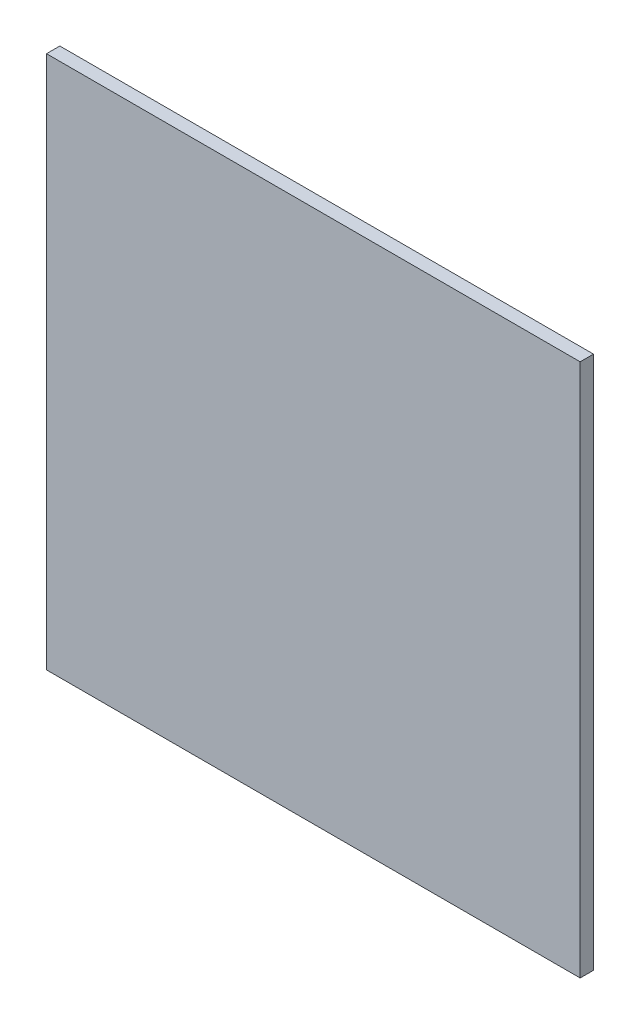
ISO-10303-21;
HEADER;
FILE_DESCRIPTION(('STEP AP214'),'2;1');
FILE_NAME('part.step','',(''),(''),'','','');
FILE_SCHEMA(('AUTOMOTIVE_DESIGN { 1 0 10303 214 1 1 1 1 }'));
ENDSEC;
DATA;
#1=APPLICATION_CONTEXT('core data for automotive mechanical design processes');
#2=APPLICATION_PROTOCOL_DEFINITION('international standard','automotive_design',2000,#1);
#3=PRODUCT_CONTEXT('',#1,'mechanical');
#4=PRODUCT('Part','Part','',(#3));
#5=PRODUCT_RELATED_PRODUCT_CATEGORY('part','',(#4));
#6=PRODUCT_DEFINITION_FORMATION('','',#4);
#7=PRODUCT_DEFINITION_CONTEXT('part definition',#1,'design');
#8=PRODUCT_DEFINITION('design','',#6,#7);
#9=PRODUCT_DEFINITION_SHAPE('','',#8);
#10=(LENGTH_UNIT() NAMED_UNIT(*) SI_UNIT(.MILLI.,.METRE.));
#11=(NAMED_UNIT(*) PLANE_ANGLE_UNIT() SI_UNIT($,.RADIAN.));
#12=(NAMED_UNIT(*) SI_UNIT($,.STERADIAN.) SOLID_ANGLE_UNIT());
#13=UNCERTAINTY_MEASURE_WITH_UNIT(LENGTH_MEASURE(1.E-05),#10,'distance_accuracy_value','');
#14=(GEOMETRIC_REPRESENTATION_CONTEXT(3) GLOBAL_UNCERTAINTY_ASSIGNED_CONTEXT((#13)) GLOBAL_UNIT_ASSIGNED_CONTEXT((#10,
#11,#12)) REPRESENTATION_CONTEXT('',''));
#15=CARTESIAN_POINT('',(0.,0.,0.));
#16=DIRECTION('',(0.,0.,1.));
#17=DIRECTION('',(1.,0.,0.));
#18=AXIS2_PLACEMENT_3D('',#15,#16,#17);
#19=CARTESIAN_POINT('',(-0.0025,0.0025,0.));
#20=DIRECTION('',(0.,0.,1.));
#21=DIRECTION('',(1.,0.,0.));
#22=AXIS2_PLACEMENT_3D('',#19,#20,#21);
#23=PLANE('',#22);
#24=DIRECTION('',(1.,0.,0.));
#25=VECTOR('',#24,1.);
#26=CARTESIAN_POINT('',(2.,2.005,0.));
#27=LINE('',#26,#25);
#28=CARTESIAN_POINT('',(2.,2.005,0.));
#29=VERTEX_POINT('',#28);
#30=CARTESIAN_POINT('',(-2.005,2.005,0.));
#31=VERTEX_POINT('',#30);
#32=EDGE_CURVE('E79',#29,#31,#27,.F.);
#33=ORIENTED_EDGE('',*,*,#32,.F.);
#34=DIRECTION('',(0.,1.,0.));
#35=VECTOR('',#34,1.);
#36=CARTESIAN_POINT('',(2.,-2.,0.));
#37=LINE('',#36,#35);
#38=CARTESIAN_POINT('',(2.,-2.,0.));
#39=VERTEX_POINT('',#38);
#40=EDGE_CURVE('E55',#39,#29,#37,.T.);
#41=ORIENTED_EDGE('',*,*,#40,.F.);
#42=DIRECTION('',(1.,0.,0.));
#43=VECTOR('',#42,1.);
#44=CARTESIAN_POINT('',(-2.005,-2.,0.));
#45=LINE('',#44,#43);
#46=CARTESIAN_POINT('',(-2.005,-2.,0.));
#47=VERTEX_POINT('',#46);
#48=EDGE_CURVE('E57',#47,#39,#45,.T.);
#49=ORIENTED_EDGE('',*,*,#48,.F.);
#50=DIRECTION('',(0.,1.,0.));
#51=VECTOR('',#50,1.);
#52=CARTESIAN_POINT('',(-2.005,2.005,0.));
#53=LINE('',#52,#51);
#54=EDGE_CURVE('E20',#31,#47,#53,.F.);
#55=ORIENTED_EDGE('',*,*,#54,.F.);
#56=EDGE_LOOP('',(#33,#41,#49,#55));
#57=FACE_BOUND('',#56,.T.);
#58=ADVANCED_FACE('F17',(#57),#23,.F.);
#59=CARTESIAN_POINT('',(-2.005,2.005,0.));
#60=DIRECTION('',(-1.,0.,0.));
#61=DIRECTION('',(0.,0.,1.));
#62=AXIS2_PLACEMENT_3D('',#59,#60,#61);
#63=PLANE('',#62);
#64=DIRECTION('',(0.,1.,0.));
#65=VECTOR('',#64,1.);
#66=CARTESIAN_POINT('',(-2.005,0.0025,0.1));
#67=LINE('',#66,#65);
#68=CARTESIAN_POINT('',(-2.005,2.005,0.1));
#69=VERTEX_POINT('',#68);
#70=CARTESIAN_POINT('',(-2.005,-2.,0.1));
#71=VERTEX_POINT('',#70);
#72=EDGE_CURVE('E83',#69,#71,#67,.F.);
#73=ORIENTED_EDGE('',*,*,#72,.F.);
#74=DIRECTION('',(0.,0.,1.));
#75=VECTOR('',#74,1.);
#76=CARTESIAN_POINT('',(-2.005,2.005,0.));
#77=LINE('',#76,#75);
#78=EDGE_CURVE('E68',#31,#69,#77,.T.);
#79=ORIENTED_EDGE('',*,*,#78,.F.);
#80=ORIENTED_EDGE('',*,*,#54,.T.);
#81=DIRECTION('',(0.,0.,-1.));
#82=VECTOR('',#81,1.);
#83=CARTESIAN_POINT('',(-2.005,-2.,0.));
#84=LINE('',#83,#82);
#85=EDGE_CURVE('E63',#71,#47,#84,.T.);
#86=ORIENTED_EDGE('',*,*,#85,.F.);
#87=EDGE_LOOP('',(#73,#79,#80,#86));
#88=FACE_BOUND('',#87,.T.);
#89=ADVANCED_FACE('F65',(#88),#63,.T.);
#90=CARTESIAN_POINT('',(-2.005,-2.,0.));
#91=DIRECTION('',(0.,-1.,0.));
#92=DIRECTION('',(0.,0.,-1.));
#93=AXIS2_PLACEMENT_3D('',#90,#91,#92);
#94=PLANE('',#93);
#95=DIRECTION('',(1.,0.,0.));
#96=VECTOR('',#95,1.);
#97=CARTESIAN_POINT('',(-0.0025,-2.,0.1));
#98=LINE('',#97,#96);
#99=CARTESIAN_POINT('',(2.,-2.,0.1));
#100=VERTEX_POINT('',#99);
#101=EDGE_CURVE('E72',#71,#100,#98,.T.);
#102=ORIENTED_EDGE('',*,*,#101,.F.);
#103=ORIENTED_EDGE('',*,*,#85,.T.);
#104=ORIENTED_EDGE('',*,*,#48,.T.);
#105=DIRECTION('',(0.,0.,-1.));
#106=VECTOR('',#105,1.);
#107=CARTESIAN_POINT('',(2.,-2.,0.));
#108=LINE('',#107,#106);
#109=EDGE_CURVE('E75',#100,#39,#108,.T.);
#110=ORIENTED_EDGE('',*,*,#109,.F.);
#111=EDGE_LOOP('',(#102,#103,#104,#110));
#112=FACE_BOUND('',#111,.T.);
#113=ADVANCED_FACE('F70',(#112),#94,.T.);
#114=CARTESIAN_POINT('',(2.,-2.,0.));
#115=DIRECTION('',(1.,0.,0.));
#116=DIRECTION('',(0.,0.,-1.));
#117=AXIS2_PLACEMENT_3D('',#114,#115,#116);
#118=PLANE('',#117);
#119=DIRECTION('',(0.,1.,0.));
#120=VECTOR('',#119,1.);
#121=CARTESIAN_POINT('',(2.,0.0025,0.1));
#122=LINE('',#121,#120);
#123=CARTESIAN_POINT('',(2.,2.005,0.1));
#124=VERTEX_POINT('',#123);
#125=EDGE_CURVE('E26',#100,#124,#122,.T.);
#126=ORIENTED_EDGE('',*,*,#125,.F.);
#127=ORIENTED_EDGE('',*,*,#109,.T.);
#128=ORIENTED_EDGE('',*,*,#40,.T.);
#129=DIRECTION('',(0.,0.,1.));
#130=VECTOR('',#129,1.);
#131=CARTESIAN_POINT('',(2.,2.005,0.));
#132=LINE('',#131,#130);
#133=EDGE_CURVE('E35',#124,#29,#132,.F.);
#134=ORIENTED_EDGE('',*,*,#133,.F.);
#135=EDGE_LOOP('',(#126,#127,#128,#134));
#136=FACE_BOUND('',#135,.T.);
#137=ADVANCED_FACE('F89',(#136),#118,.T.);
#138=CARTESIAN_POINT('',(2.,2.005,0.));
#139=DIRECTION('',(0.,1.,0.));
#140=DIRECTION('',(0.,0.,1.));
#141=AXIS2_PLACEMENT_3D('',#138,#139,#140);
#142=PLANE('',#141);
#143=DIRECTION('',(1.,0.,0.));
#144=VECTOR('',#143,1.);
#145=CARTESIAN_POINT('',(-0.0025,2.005,0.1));
#146=LINE('',#145,#144);
#147=EDGE_CURVE('E11',#124,#69,#146,.F.);
#148=ORIENTED_EDGE('',*,*,#147,.F.);
#149=ORIENTED_EDGE('',*,*,#133,.T.);
#150=ORIENTED_EDGE('',*,*,#32,.T.);
#151=ORIENTED_EDGE('',*,*,#78,.T.);
#152=EDGE_LOOP('',(#148,#149,#150,#151));
#153=FACE_BOUND('',#152,.T.);
#154=ADVANCED_FACE('F91',(#153),#142,.T.);
#155=CARTESIAN_POINT('',(-0.0025,0.0025,0.1));
#156=DIRECTION('',(0.,0.,1.));
#157=DIRECTION('',(1.,0.,0.));
#158=AXIS2_PLACEMENT_3D('',#155,#156,#157);
#159=PLANE('',#158);
#160=ORIENTED_EDGE('',*,*,#125,.T.);
#161=ORIENTED_EDGE('',*,*,#147,.T.);
#162=ORIENTED_EDGE('',*,*,#72,.T.);
#163=ORIENTED_EDGE('',*,*,#101,.T.);
#164=EDGE_LOOP('',(#160,#161,#162,#163));
#165=FACE_BOUND('',#164,.T.);
#166=ADVANCED_FACE('F88',(#165),#159,.T.);
#167=CLOSED_SHELL('',(#58,#89,#113,#137,#154,#166));
#168=MANIFOLD_SOLID_BREP('B1',#167);
#169=ADVANCED_BREP_SHAPE_REPRESENTATION('',(#18,#168),#14);
#170=SHAPE_DEFINITION_REPRESENTATION(#9,#169);
ENDSEC;
END-ISO-10303-21;
